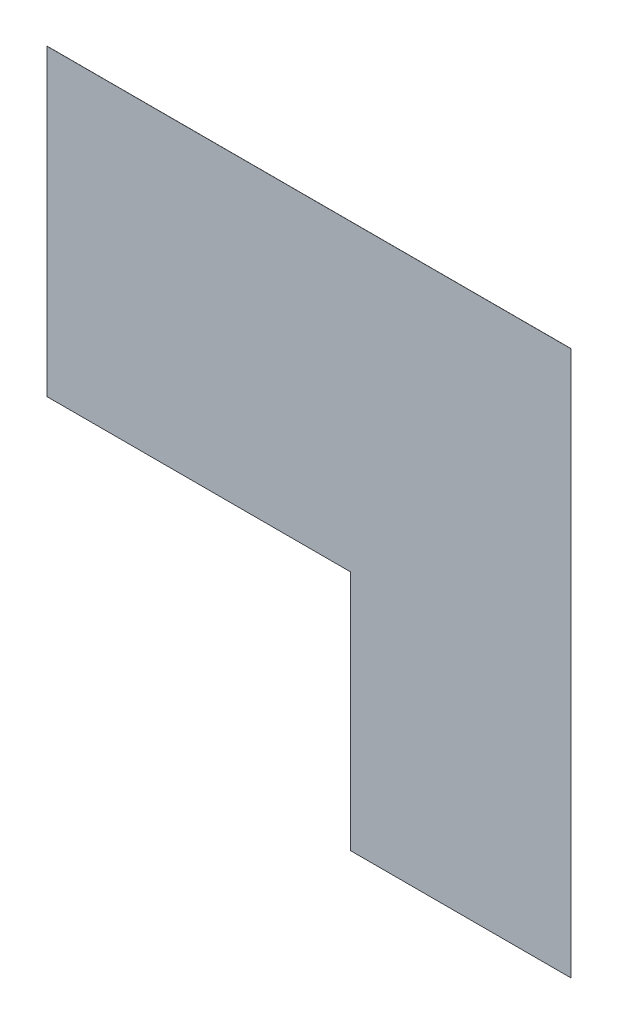
ISO-10303-21;
HEADER;
FILE_DESCRIPTION(('STEP AP214'),'2;1');
FILE_NAME('part.step','',(''),(''),'','','');
FILE_SCHEMA(('AUTOMOTIVE_DESIGN { 1 0 10303 214 1 1 1 1 }'));
ENDSEC;
DATA;
#1=APPLICATION_CONTEXT('core data for automotive mechanical design processes');
#2=APPLICATION_PROTOCOL_DEFINITION('international standard','automotive_design',2000,#1);
#3=PRODUCT_CONTEXT('',#1,'mechanical');
#4=PRODUCT('Part','Part','',(#3));
#5=PRODUCT_RELATED_PRODUCT_CATEGORY('part','',(#4));
#6=PRODUCT_DEFINITION_FORMATION('','',#4);
#7=PRODUCT_DEFINITION_CONTEXT('part definition',#1,'design');
#8=PRODUCT_DEFINITION('design','',#6,#7);
#9=PRODUCT_DEFINITION_SHAPE('','',#8);
#10=(LENGTH_UNIT() NAMED_UNIT(*) SI_UNIT(.MILLI.,.METRE.));
#11=(NAMED_UNIT(*) PLANE_ANGLE_UNIT() SI_UNIT($,.RADIAN.));
#12=(NAMED_UNIT(*) SI_UNIT($,.STERADIAN.) SOLID_ANGLE_UNIT());
#13=UNCERTAINTY_MEASURE_WITH_UNIT(LENGTH_MEASURE(1.E-05),#10,'distance_accuracy_value','');
#14=(GEOMETRIC_REPRESENTATION_CONTEXT(3) GLOBAL_UNCERTAINTY_ASSIGNED_CONTEXT((#13)) GLOBAL_UNIT_ASSIGNED_CONTEXT((#10,
#11,#12)) REPRESENTATION_CONTEXT('',''));
#15=CARTESIAN_POINT('',(0.,0.,0.));
#16=DIRECTION('',(0.,0.,1.));
#17=DIRECTION('',(1.,0.,0.));
#18=AXIS2_PLACEMENT_3D('',#15,#16,#17);
#19=CARTESIAN_POINT('',(120.65,0.,0.0254));
#20=DIRECTION('',(0.,1.,0.));
#21=DIRECTION('',(0.,0.,1.));
#22=AXIS2_PLACEMENT_3D('',#19,#20,#21);
#23=PLANE('',#22);
#24=DIRECTION('',(1.,0.,0.));
#25=VECTOR('',#24,1.);
#26=CARTESIAN_POINT('',(120.65,0.,0.));
#27=LINE('',#26,#25);
#28=CARTESIAN_POINT('',(0.,0.,0.));
#29=VERTEX_POINT('',#28);
#30=CARTESIAN_POINT('',(69.85,0.,0.));
#31=VERTEX_POINT('',#30);
#32=EDGE_CURVE('E114',#29,#31,#27,.T.);
#33=ORIENTED_EDGE('',*,*,#32,.T.);
#34=DIRECTION('',(0.,0.,1.));
#35=VECTOR('',#34,1.);
#36=CARTESIAN_POINT('',(69.85,0.,0.));
#37=LINE('',#36,#35);
#38=CARTESIAN_POINT('',(69.85,0.,0.0254));
#39=VERTEX_POINT('',#38);
#40=EDGE_CURVE('E99',#31,#39,#37,.T.);
#41=ORIENTED_EDGE('',*,*,#40,.T.);
#42=DIRECTION('',(1.,0.,0.));
#43=VECTOR('',#42,1.);
#44=CARTESIAN_POINT('',(120.65,0.,0.0254));
#45=LINE('',#44,#43);
#46=CARTESIAN_POINT('',(0.,0.,0.0254));
#47=VERTEX_POINT('',#46);
#48=EDGE_CURVE('E137',#47,#39,#45,.T.);
#49=ORIENTED_EDGE('',*,*,#48,.F.);
#50=DIRECTION('',(0.,0.,-1.));
#51=VECTOR('',#50,1.);
#52=CARTESIAN_POINT('',(0.,0.,0.0254));
#53=LINE('',#52,#51);
#54=EDGE_CURVE('E119',#47,#29,#53,.T.);
#55=ORIENTED_EDGE('',*,*,#54,.T.);
#56=EDGE_LOOP('',(#33,#41,#49,#55));
#57=FACE_BOUND('',#56,.T.);
#58=ADVANCED_FACE('F39',(#57),#23,.F.);
#59=CARTESIAN_POINT('',(120.65,69.85,0.0254));
#60=DIRECTION('',(-1.,0.,0.));
#61=DIRECTION('',(0.,0.,1.));
#62=AXIS2_PLACEMENT_3D('',#59,#60,#61);
#63=PLANE('',#62);
#64=DIRECTION('',(0.,1.,0.));
#65=VECTOR('',#64,1.);
#66=CARTESIAN_POINT('',(120.65,69.85,0.));
#67=LINE('',#66,#65);
#68=CARTESIAN_POINT('',(120.65,-55.5625,0.));
#69=VERTEX_POINT('',#68);
#70=CARTESIAN_POINT('',(120.65,69.85,0.));
#71=VERTEX_POINT('',#70);
#72=EDGE_CURVE('E121',#69,#71,#67,.T.);
#73=ORIENTED_EDGE('',*,*,#72,.T.);
#74=DIRECTION('',(0.,0.,-1.));
#75=VECTOR('',#74,1.);
#76=CARTESIAN_POINT('',(120.65,69.85,0.0254));
#77=LINE('',#76,#75);
#78=CARTESIAN_POINT('',(120.65,69.85,0.0254));
#79=VERTEX_POINT('',#78);
#80=EDGE_CURVE('E11',#79,#71,#77,.T.);
#81=ORIENTED_EDGE('',*,*,#80,.F.);
#82=DIRECTION('',(0.,1.,0.));
#83=VECTOR('',#82,1.);
#84=CARTESIAN_POINT('',(120.65,69.85,0.0254));
#85=LINE('',#84,#83);
#86=CARTESIAN_POINT('',(120.65,-55.5625,0.0254));
#87=VERTEX_POINT('',#86);
#88=EDGE_CURVE('E85',#87,#79,#85,.T.);
#89=ORIENTED_EDGE('',*,*,#88,.F.);
#90=DIRECTION('',(0.,0.,1.));
#91=VECTOR('',#90,1.);
#92=CARTESIAN_POINT('',(120.65,-55.5625,0.));
#93=LINE('',#92,#91);
#94=EDGE_CURVE('E122',#69,#87,#93,.T.);
#95=ORIENTED_EDGE('',*,*,#94,.F.);
#96=EDGE_LOOP('',(#73,#81,#89,#95));
#97=FACE_BOUND('',#96,.T.);
#98=ADVANCED_FACE('F149',(#97),#63,.F.);
#99=CARTESIAN_POINT('',(0.,69.85,0.0254));
#100=DIRECTION('',(0.,-1.,0.));
#101=DIRECTION('',(0.,0.,-1.));
#102=AXIS2_PLACEMENT_3D('',#99,#100,#101);
#103=PLANE('',#102);
#104=DIRECTION('',(-1.,0.,0.));
#105=VECTOR('',#104,1.);
#106=CARTESIAN_POINT('',(0.,69.85,0.));
#107=LINE('',#106,#105);
#108=CARTESIAN_POINT('',(0.,69.85,0.));
#109=VERTEX_POINT('',#108);
#110=EDGE_CURVE('E126',#71,#109,#107,.T.);
#111=ORIENTED_EDGE('',*,*,#110,.T.);
#112=DIRECTION('',(0.,0.,-1.));
#113=VECTOR('',#112,1.);
#114=CARTESIAN_POINT('',(0.,69.85,0.0254));
#115=LINE('',#114,#113);
#116=CARTESIAN_POINT('',(0.,69.85,0.0254));
#117=VERTEX_POINT('',#116);
#118=EDGE_CURVE('E47',#117,#109,#115,.T.);
#119=ORIENTED_EDGE('',*,*,#118,.F.);
#120=DIRECTION('',(-1.,0.,0.));
#121=VECTOR('',#120,1.);
#122=CARTESIAN_POINT('',(0.,69.85,0.0254));
#123=LINE('',#122,#121);
#124=EDGE_CURVE('E147',#79,#117,#123,.T.);
#125=ORIENTED_EDGE('',*,*,#124,.F.);
#126=ORIENTED_EDGE('',*,*,#80,.T.);
#127=EDGE_LOOP('',(#111,#119,#125,#126));
#128=FACE_BOUND('',#127,.T.);
#129=ADVANCED_FACE('F146',(#128),#103,.F.);
#130=CARTESIAN_POINT('',(0.,0.,0.0254));
#131=DIRECTION('',(1.,0.,0.));
#132=DIRECTION('',(0.,0.,-1.));
#133=AXIS2_PLACEMENT_3D('',#130,#131,#132);
#134=PLANE('',#133);
#135=DIRECTION('',(0.,-1.,0.));
#136=VECTOR('',#135,1.);
#137=CARTESIAN_POINT('',(0.,0.,0.));
#138=LINE('',#137,#136);
#139=EDGE_CURVE('E80',#109,#29,#138,.T.);
#140=ORIENTED_EDGE('',*,*,#139,.T.);
#141=ORIENTED_EDGE('',*,*,#54,.F.);
#142=DIRECTION('',(0.,-1.,0.));
#143=VECTOR('',#142,1.);
#144=CARTESIAN_POINT('',(0.,0.,0.0254));
#145=LINE('',#144,#143);
#146=EDGE_CURVE('E63',#117,#47,#145,.T.);
#147=ORIENTED_EDGE('',*,*,#146,.F.);
#148=ORIENTED_EDGE('',*,*,#118,.T.);
#149=EDGE_LOOP('',(#140,#141,#147,#148));
#150=FACE_BOUND('',#149,.T.);
#151=ADVANCED_FACE('F141',(#150),#134,.F.);
#152=CARTESIAN_POINT('',(0.,0.,0.0254));
#153=DIRECTION('',(0.,0.,-1.));
#154=DIRECTION('',(-1.,0.,0.));
#155=AXIS2_PLACEMENT_3D('',#152,#153,#154);
#156=PLANE('',#155);
#157=ORIENTED_EDGE('',*,*,#48,.T.);
#158=DIRECTION('',(0.,-1.,0.));
#159=VECTOR('',#158,1.);
#160=CARTESIAN_POINT('',(69.85,-55.5625,0.0254));
#161=LINE('',#160,#159);
#162=CARTESIAN_POINT('',(69.85,-55.5625,0.0254));
#163=VERTEX_POINT('',#162);
#164=EDGE_CURVE('E54',#39,#163,#161,.T.);
#165=ORIENTED_EDGE('',*,*,#164,.T.);
#166=DIRECTION('',(1.,0.,0.));
#167=VECTOR('',#166,1.);
#168=CARTESIAN_POINT('',(120.65,-55.5625,0.0254));
#169=LINE('',#168,#167);
#170=EDGE_CURVE('E117',#163,#87,#169,.T.);
#171=ORIENTED_EDGE('',*,*,#170,.T.);
#172=ORIENTED_EDGE('',*,*,#88,.T.);
#173=ORIENTED_EDGE('',*,*,#124,.T.);
#174=ORIENTED_EDGE('',*,*,#146,.T.);
#175=EDGE_LOOP('',(#157,#165,#171,#172,#173,#174));
#176=FACE_BOUND('',#175,.T.);
#177=ADVANCED_FACE('F167',(#176),#156,.F.);
#178=CARTESIAN_POINT('',(0.,0.,0.));
#179=DIRECTION('',(0.,0.,-1.));
#180=DIRECTION('',(-1.,0.,0.));
#181=AXIS2_PLACEMENT_3D('',#178,#179,#180);
#182=PLANE('',#181);
#183=ORIENTED_EDGE('',*,*,#32,.F.);
#184=ORIENTED_EDGE('',*,*,#139,.F.);
#185=ORIENTED_EDGE('',*,*,#110,.F.);
#186=ORIENTED_EDGE('',*,*,#72,.F.);
#187=DIRECTION('',(1.,0.,0.));
#188=VECTOR('',#187,1.);
#189=CARTESIAN_POINT('',(120.65,-55.5625,0.));
#190=LINE('',#189,#188);
#191=CARTESIAN_POINT('',(69.85,-55.5625,0.));
#192=VERTEX_POINT('',#191);
#193=EDGE_CURVE('E108',#192,#69,#190,.T.);
#194=ORIENTED_EDGE('',*,*,#193,.F.);
#195=DIRECTION('',(0.,-1.,0.));
#196=VECTOR('',#195,1.);
#197=CARTESIAN_POINT('',(69.85,-55.5625,0.));
#198=LINE('',#197,#196);
#199=EDGE_CURVE('E102',#31,#192,#198,.T.);
#200=ORIENTED_EDGE('',*,*,#199,.F.);
#201=EDGE_LOOP('',(#183,#184,#185,#186,#194,#200));
#202=FACE_BOUND('',#201,.T.);
#203=ADVANCED_FACE('F113',(#202),#182,.T.);
#204=CARTESIAN_POINT('',(120.65,-55.5625,0.));
#205=DIRECTION('',(0.,-1.,0.));
#206=DIRECTION('',(1.,0.,0.));
#207=AXIS2_PLACEMENT_3D('',#204,#205,#206);
#208=PLANE('',#207);
#209=ORIENTED_EDGE('',*,*,#170,.F.);
#210=DIRECTION('',(0.,0.,1.));
#211=VECTOR('',#210,1.);
#212=CARTESIAN_POINT('',(69.85,-55.5625,0.));
#213=LINE('',#212,#211);
#214=EDGE_CURVE('E107',#192,#163,#213,.T.);
#215=ORIENTED_EDGE('',*,*,#214,.F.);
#216=ORIENTED_EDGE('',*,*,#193,.T.);
#217=ORIENTED_EDGE('',*,*,#94,.T.);
#218=EDGE_LOOP('',(#209,#215,#216,#217));
#219=FACE_BOUND('',#218,.T.);
#220=ADVANCED_FACE('F152',(#219),#208,.T.);
#221=CARTESIAN_POINT('',(69.85,-55.5625,0.));
#222=DIRECTION('',(-1.,0.,0.));
#223=DIRECTION('',(0.,-1.,0.));
#224=AXIS2_PLACEMENT_3D('',#221,#222,#223);
#225=PLANE('',#224);
#226=ORIENTED_EDGE('',*,*,#164,.F.);
#227=ORIENTED_EDGE('',*,*,#40,.F.);
#228=ORIENTED_EDGE('',*,*,#199,.T.);
#229=ORIENTED_EDGE('',*,*,#214,.T.);
#230=EDGE_LOOP('',(#226,#227,#228,#229));
#231=FACE_BOUND('',#230,.T.);
#232=ADVANCED_FACE('F101',(#231),#225,.T.);
#233=CLOSED_SHELL('',(#58,#98,#129,#151,#177,#203,#220,#232));
#234=MANIFOLD_SOLID_BREP('B2',#233);
#235=ADVANCED_BREP_SHAPE_REPRESENTATION('',(#18,#234),#14);
#236=SHAPE_DEFINITION_REPRESENTATION(#9,#235);
ENDSEC;
END-ISO-10303-21;
